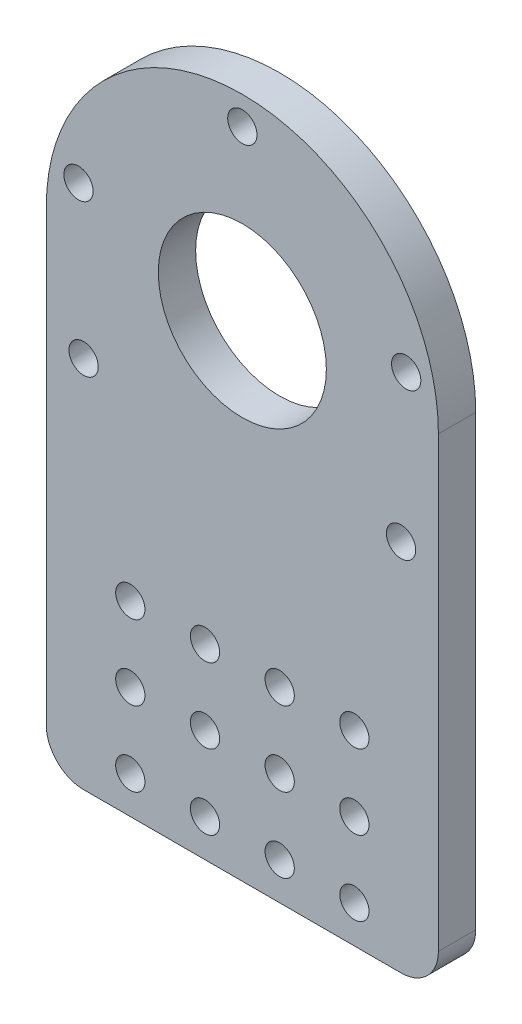
ISO-10303-21;
HEADER;
FILE_DESCRIPTION(('STEP AP214'),'2;1');
FILE_NAME('part.step','',(''),(''),'','','');
FILE_SCHEMA(('AUTOMOTIVE_DESIGN { 1 0 10303 214 1 1 1 1 }'));
ENDSEC;
DATA;
#1=APPLICATION_CONTEXT('core data for automotive mechanical design processes');
#2=APPLICATION_PROTOCOL_DEFINITION('international standard','automotive_design',2000,#1);
#3=PRODUCT_CONTEXT('',#1,'mechanical');
#4=PRODUCT('Part','Part','',(#3));
#5=PRODUCT_RELATED_PRODUCT_CATEGORY('part','',(#4));
#6=PRODUCT_DEFINITION_FORMATION('','',#4);
#7=PRODUCT_DEFINITION_CONTEXT('part definition',#1,'design');
#8=PRODUCT_DEFINITION('design','',#6,#7);
#9=PRODUCT_DEFINITION_SHAPE('','',#8);
#10=(LENGTH_UNIT() NAMED_UNIT(*) SI_UNIT(.MILLI.,.METRE.));
#11=(NAMED_UNIT(*) PLANE_ANGLE_UNIT() SI_UNIT($,.RADIAN.));
#12=(NAMED_UNIT(*) SI_UNIT($,.STERADIAN.) SOLID_ANGLE_UNIT());
#13=UNCERTAINTY_MEASURE_WITH_UNIT(LENGTH_MEASURE(1.E-05),#10,'distance_accuracy_value','');
#14=(GEOMETRIC_REPRESENTATION_CONTEXT(3) GLOBAL_UNCERTAINTY_ASSIGNED_CONTEXT((#13)) GLOBAL_UNIT_ASSIGNED_CONTEXT((#10,
#11,#12)) REPRESENTATION_CONTEXT('',''));
#15=CARTESIAN_POINT('',(0.,0.,0.));
#16=DIRECTION('',(0.,0.,1.));
#17=DIRECTION('',(1.,0.,0.));
#18=AXIS2_PLACEMENT_3D('',#15,#16,#17);
#19=CARTESIAN_POINT('',(0.,0.,3.175));
#20=DIRECTION('',(0.,0.,1.));
#21=DIRECTION('',(1.,0.,0.));
#22=AXIS2_PLACEMENT_3D('',#19,#20,#21);
#23=PLANE('',#22);
#24=CARTESIAN_POINT('',(27.86051192997,6.35,3.175));
#25=DIRECTION('',(0.,0.,1.));
#26=DIRECTION('',(1.,0.,0.));
#27=AXIS2_PLACEMENT_3D('',#24,#25,#26);
#28=CIRCLE('',#27,2.4892);
#29=CARTESIAN_POINT('',(30.34971192997,6.35,3.175));
#30=VERTEX_POINT('',#29);
#31=EDGE_CURVE('E485',#30,#30,#28,.T.);
#32=ORIENTED_EDGE('',*,*,#31,.F.);
#33=EDGE_LOOP('',(#32));
#34=FACE_BOUND('',#33,.T.);
#35=CARTESIAN_POINT('',(-27.86051192997,6.35,3.175));
#36=DIRECTION('',(0.,0.,1.));
#37=DIRECTION('',(1.,0.,0.));
#38=AXIS2_PLACEMENT_3D('',#35,#36,#37);
#39=CIRCLE('',#38,2.4892);
#40=CARTESIAN_POINT('',(-25.37131192997,6.35,3.175));
#41=VERTEX_POINT('',#40);
#42=EDGE_CURVE('E501',#41,#41,#39,.T.);
#43=ORIENTED_EDGE('',*,*,#42,.F.);
#44=EDGE_LOOP('',(#43));
#45=FACE_BOUND('',#44,.T.);
#46=CARTESIAN_POINT('',(0.,28.575,3.175));
#47=DIRECTION('',(0.,0.,1.));
#48=DIRECTION('',(1.,0.,0.));
#49=AXIS2_PLACEMENT_3D('',#46,#47,#48);
#50=CIRCLE('',#49,2.4892);
#51=CARTESIAN_POINT('',(2.4892,28.575,3.175));
#52=VERTEX_POINT('',#51);
#53=EDGE_CURVE('E517',#52,#52,#50,.T.);
#54=ORIENTED_EDGE('',*,*,#53,.F.);
#55=EDGE_LOOP('',(#54));
#56=FACE_BOUND('',#55,.T.);
#57=CARTESIAN_POINT('',(26.9875,-19.05,3.175));
#58=DIRECTION('',(0.,0.,1.));
#59=DIRECTION('',(1.,0.,0.));
#60=AXIS2_PLACEMENT_3D('',#57,#58,#59);
#61=CIRCLE('',#60,2.4892);
#62=CARTESIAN_POINT('',(29.4767,-19.05,3.175));
#63=VERTEX_POINT('',#62);
#64=EDGE_CURVE('E533',#63,#63,#61,.T.);
#65=ORIENTED_EDGE('',*,*,#64,.F.);
#66=EDGE_LOOP('',(#65));
#67=FACE_BOUND('',#66,.T.);
#68=CARTESIAN_POINT('',(-6.35,-50.8,3.175));
#69=DIRECTION('',(0.,0.,1.));
#70=DIRECTION('',(1.,0.,0.));
#71=AXIS2_PLACEMENT_3D('',#68,#69,#70);
#72=CIRCLE('',#71,2.48919999999999);
#73=CARTESIAN_POINT('',(-3.8608,-50.8,3.175));
#74=VERTEX_POINT('',#73);
#75=EDGE_CURVE('E549',#74,#74,#72,.T.);
#76=ORIENTED_EDGE('',*,*,#75,.F.);
#77=EDGE_LOOP('',(#76));
#78=FACE_BOUND('',#77,.T.);
#79=CARTESIAN_POINT('',(6.35,-63.5,3.175));
#80=DIRECTION('',(0.,0.,1.));
#81=DIRECTION('',(1.,0.,0.));
#82=AXIS2_PLACEMENT_3D('',#79,#80,#81);
#83=CIRCLE('',#82,2.48919999999999);
#84=CARTESIAN_POINT('',(8.83919999999999,-63.5,3.175));
#85=VERTEX_POINT('',#84);
#86=EDGE_CURVE('E565',#85,#85,#83,.T.);
#87=ORIENTED_EDGE('',*,*,#86,.F.);
#88=EDGE_LOOP('',(#87));
#89=FACE_BOUND('',#88,.T.);
#90=CARTESIAN_POINT('',(-6.35,-63.5,3.175));
#91=DIRECTION('',(0.,0.,1.));
#92=DIRECTION('',(1.,0.,0.));
#93=AXIS2_PLACEMENT_3D('',#90,#91,#92);
#94=CIRCLE('',#93,2.48919999999999);
#95=CARTESIAN_POINT('',(-3.8608,-63.5,3.175));
#96=VERTEX_POINT('',#95);
#97=EDGE_CURVE('E581',#96,#96,#94,.T.);
#98=ORIENTED_EDGE('',*,*,#97,.F.);
#99=EDGE_LOOP('',(#98));
#100=FACE_BOUND('',#99,.T.);
#101=CARTESIAN_POINT('',(6.35,-76.2,3.175));
#102=DIRECTION('',(0.,0.,1.));
#103=DIRECTION('',(1.,0.,0.));
#104=AXIS2_PLACEMENT_3D('',#101,#102,#103);
#105=CIRCLE('',#104,2.48919999999999);
#106=CARTESIAN_POINT('',(8.83919999999999,-76.2,3.175));
#107=VERTEX_POINT('',#106);
#108=EDGE_CURVE('E597',#107,#107,#105,.T.);
#109=ORIENTED_EDGE('',*,*,#108,.F.);
#110=EDGE_LOOP('',(#109));
#111=FACE_BOUND('',#110,.T.);
#112=CARTESIAN_POINT('',(0.,0.,3.175));
#113=DIRECTION('',(0.,0.,1.));
#114=DIRECTION('',(1.,0.,0.));
#115=AXIS2_PLACEMENT_3D('',#112,#113,#114);
#116=CIRCLE('',#115,14.2875);
#117=CARTESIAN_POINT('',(14.2875,0.,3.175));
#118=VERTEX_POINT('',#117);
#119=EDGE_CURVE('E165',#118,#118,#116,.T.);
#120=ORIENTED_EDGE('',*,*,#119,.F.);
#121=EDGE_LOOP('',(#120));
#122=FACE_BOUND('',#121,.T.);
#123=DIRECTION('',(0.,-1.,0.));
#124=VECTOR('',#123,1.);
#125=CARTESIAN_POINT('',(-33.3375,0.,3.175));
#126=LINE('',#125,#124);
#127=CARTESIAN_POINT('',(-33.3375,0.,3.175));
#128=VERTEX_POINT('',#127);
#129=CARTESIAN_POINT('',(-33.3375,-76.2,3.175));
#130=VERTEX_POINT('',#129);
#131=EDGE_CURVE('E97',#128,#130,#126,.T.);
#132=ORIENTED_EDGE('',*,*,#131,.T.);
#133=CARTESIAN_POINT('',(-26.9875,-76.2,3.175));
#134=DIRECTION('',(0.,0.,1.));
#135=DIRECTION('',(1.,0.,0.));
#136=AXIS2_PLACEMENT_3D('',#133,#134,#135);
#137=CIRCLE('',#136,6.35);
#138=CARTESIAN_POINT('',(-26.9875,-82.55,3.175));
#139=VERTEX_POINT('',#138);
#140=EDGE_CURVE('E52',#130,#139,#137,.T.);
#141=ORIENTED_EDGE('',*,*,#140,.T.);
#142=DIRECTION('',(1.,0.,0.));
#143=VECTOR('',#142,1.);
#144=CARTESIAN_POINT('',(-33.3375,-82.55,3.175));
#145=LINE('',#144,#143);
#146=CARTESIAN_POINT('',(26.9875,-82.55,3.175));
#147=VERTEX_POINT('',#146);
#148=EDGE_CURVE('E105',#139,#147,#145,.T.);
#149=ORIENTED_EDGE('',*,*,#148,.T.);
#150=CARTESIAN_POINT('',(26.9875,-76.2,3.175));
#151=DIRECTION('',(0.,0.,1.));
#152=DIRECTION('',(1.,0.,0.));
#153=AXIS2_PLACEMENT_3D('',#150,#151,#152);
#154=CIRCLE('',#153,6.35);
#155=CARTESIAN_POINT('',(33.3375,-76.2,3.175));
#156=VERTEX_POINT('',#155);
#157=EDGE_CURVE('E59',#147,#156,#154,.T.);
#158=ORIENTED_EDGE('',*,*,#157,.T.);
#159=DIRECTION('',(0.,1.,0.));
#160=VECTOR('',#159,1.);
#161=CARTESIAN_POINT('',(33.3375,0.,3.175));
#162=LINE('',#161,#160);
#163=CARTESIAN_POINT('',(33.3375,0.,3.175));
#164=VERTEX_POINT('',#163);
#165=EDGE_CURVE('E110',#156,#164,#162,.T.);
#166=ORIENTED_EDGE('',*,*,#165,.T.);
#167=CARTESIAN_POINT('',(0.,0.,3.175));
#168=DIRECTION('',(0.,0.,1.));
#169=DIRECTION('',(1.,0.,0.));
#170=AXIS2_PLACEMENT_3D('',#167,#168,#169);
#171=CIRCLE('',#170,33.3375);
#172=EDGE_CURVE('E106',#164,#128,#171,.T.);
#173=ORIENTED_EDGE('',*,*,#172,.T.);
#174=EDGE_LOOP('',(#132,#141,#149,#158,#166,#173));
#175=FACE_BOUND('',#174,.T.);
#176=CARTESIAN_POINT('',(-19.05,-76.2,3.175));
#177=DIRECTION('',(0.,0.,1.));
#178=DIRECTION('',(1.,0.,0.));
#179=AXIS2_PLACEMENT_3D('',#176,#177,#178);
#180=CIRCLE('',#179,2.48919999999999);
#181=CARTESIAN_POINT('',(-16.5608,-76.2,3.175));
#182=VERTEX_POINT('',#181);
#183=EDGE_CURVE('E605',#182,#182,#180,.T.);
#184=ORIENTED_EDGE('',*,*,#183,.F.);
#185=EDGE_LOOP('',(#184));
#186=FACE_BOUND('',#185,.T.);
#187=CARTESIAN_POINT('',(-6.35,-76.2,3.175));
#188=DIRECTION('',(0.,0.,1.));
#189=DIRECTION('',(1.,0.,0.));
#190=AXIS2_PLACEMENT_3D('',#187,#188,#189);
#191=CIRCLE('',#190,2.48919999999999);
#192=CARTESIAN_POINT('',(-3.8608,-76.2,3.175));
#193=VERTEX_POINT('',#192);
#194=EDGE_CURVE('E589',#193,#193,#191,.T.);
#195=ORIENTED_EDGE('',*,*,#194,.F.);
#196=EDGE_LOOP('',(#195));
#197=FACE_BOUND('',#196,.T.);
#198=CARTESIAN_POINT('',(-19.05,-63.5,3.175));
#199=DIRECTION('',(0.,0.,1.));
#200=DIRECTION('',(1.,0.,0.));
#201=AXIS2_PLACEMENT_3D('',#198,#199,#200);
#202=CIRCLE('',#201,2.48919999999999);
#203=CARTESIAN_POINT('',(-16.5608,-63.5,3.175));
#204=VERTEX_POINT('',#203);
#205=EDGE_CURVE('E573',#204,#204,#202,.T.);
#206=ORIENTED_EDGE('',*,*,#205,.F.);
#207=EDGE_LOOP('',(#206));
#208=FACE_BOUND('',#207,.T.);
#209=CARTESIAN_POINT('',(-19.05,-50.8,3.175));
#210=DIRECTION('',(0.,0.,1.));
#211=DIRECTION('',(1.,0.,0.));
#212=AXIS2_PLACEMENT_3D('',#209,#210,#211);
#213=CIRCLE('',#212,2.48919999999999);
#214=CARTESIAN_POINT('',(-16.5608,-50.8,3.175));
#215=VERTEX_POINT('',#214);
#216=EDGE_CURVE('E557',#215,#215,#213,.T.);
#217=ORIENTED_EDGE('',*,*,#216,.F.);
#218=EDGE_LOOP('',(#217));
#219=FACE_BOUND('',#218,.T.);
#220=CARTESIAN_POINT('',(6.35,-50.8,3.175));
#221=DIRECTION('',(0.,0.,1.));
#222=DIRECTION('',(1.,0.,0.));
#223=AXIS2_PLACEMENT_3D('',#220,#221,#222);
#224=CIRCLE('',#223,2.48919999999999);
#225=CARTESIAN_POINT('',(8.83919999999999,-50.8,3.175));
#226=VERTEX_POINT('',#225);
#227=EDGE_CURVE('E541',#226,#226,#224,.T.);
#228=ORIENTED_EDGE('',*,*,#227,.F.);
#229=EDGE_LOOP('',(#228));
#230=FACE_BOUND('',#229,.T.);
#231=CARTESIAN_POINT('',(19.05,-76.2,3.175));
#232=DIRECTION('',(0.,0.,1.));
#233=DIRECTION('',(1.,0.,0.));
#234=AXIS2_PLACEMENT_3D('',#231,#232,#233);
#235=CIRCLE('',#234,2.48919999999999);
#236=CARTESIAN_POINT('',(21.5392,-76.2,3.175));
#237=VERTEX_POINT('',#236);
#238=EDGE_CURVE('E525',#237,#237,#235,.T.);
#239=ORIENTED_EDGE('',*,*,#238,.F.);
#240=EDGE_LOOP('',(#239));
#241=FACE_BOUND('',#240,.T.);
#242=CARTESIAN_POINT('',(19.05,-63.5,3.175));
#243=DIRECTION('',(0.,0.,1.));
#244=DIRECTION('',(1.,0.,0.));
#245=AXIS2_PLACEMENT_3D('',#242,#243,#244);
#246=CIRCLE('',#245,2.48919999999999);
#247=CARTESIAN_POINT('',(21.5392,-63.5,3.175));
#248=VERTEX_POINT('',#247);
#249=EDGE_CURVE('E509',#248,#248,#246,.T.);
#250=ORIENTED_EDGE('',*,*,#249,.F.);
#251=EDGE_LOOP('',(#250));
#252=FACE_BOUND('',#251,.T.);
#253=CARTESIAN_POINT('',(19.05,-50.8,3.175));
#254=DIRECTION('',(0.,0.,1.));
#255=DIRECTION('',(1.,0.,0.));
#256=AXIS2_PLACEMENT_3D('',#253,#254,#255);
#257=CIRCLE('',#256,2.48919999999999);
#258=CARTESIAN_POINT('',(21.5392,-50.8,3.175));
#259=VERTEX_POINT('',#258);
#260=EDGE_CURVE('E493',#259,#259,#257,.T.);
#261=ORIENTED_EDGE('',*,*,#260,.F.);
#262=EDGE_LOOP('',(#261));
#263=FACE_BOUND('',#262,.T.);
#264=CARTESIAN_POINT('',(-26.9875,-19.05,3.175));
#265=DIRECTION('',(0.,0.,1.));
#266=DIRECTION('',(-1.,0.,0.));
#267=AXIS2_PLACEMENT_3D('',#264,#265,#266);
#268=CIRCLE('',#267,2.4892);
#269=CARTESIAN_POINT('',(-29.4767,-19.05,3.175));
#270=VERTEX_POINT('',#269);
#271=EDGE_CURVE('E474',#270,#270,#268,.T.);
#272=ORIENTED_EDGE('',*,*,#271,.F.);
#273=EDGE_LOOP('',(#272));
#274=FACE_BOUND('',#273,.T.);
#275=ADVANCED_FACE('F43',(#34,#45,#56,#67,#78,#89,#100,#111,#122,#175,#186,#197,#208,#219,#230,
#241,#252,#263,#274),#23,.T.);
#276=CARTESIAN_POINT('',(0.,0.,-3.175));
#277=DIRECTION('',(0.,0.,1.));
#278=DIRECTION('',(1.,0.,0.));
#279=AXIS2_PLACEMENT_3D('',#276,#277,#278);
#280=PLANE('',#279);
#281=DIRECTION('',(1.,0.,0.));
#282=VECTOR('',#281,1.);
#283=CARTESIAN_POINT('',(-33.3375,-82.55,-3.175));
#284=LINE('',#283,#282);
#285=CARTESIAN_POINT('',(-26.9875,-82.55,-3.175));
#286=VERTEX_POINT('',#285);
#287=CARTESIAN_POINT('',(26.9875,-82.55,-3.175));
#288=VERTEX_POINT('',#287);
#289=EDGE_CURVE('E159',#286,#288,#284,.T.);
#290=ORIENTED_EDGE('',*,*,#289,.F.);
#291=CARTESIAN_POINT('',(-26.9875,-76.2,-3.175));
#292=DIRECTION('',(0.,0.,1.));
#293=DIRECTION('',(1.,0.,0.));
#294=AXIS2_PLACEMENT_3D('',#291,#292,#293);
#295=CIRCLE('',#294,6.35);
#296=CARTESIAN_POINT('',(-33.3375,-76.2,-3.175));
#297=VERTEX_POINT('',#296);
#298=EDGE_CURVE('E137',#286,#297,#295,.F.);
#299=ORIENTED_EDGE('',*,*,#298,.T.);
#300=DIRECTION('',(0.,-1.,0.));
#301=VECTOR('',#300,1.);
#302=CARTESIAN_POINT('',(-33.3375,0.,-3.175));
#303=LINE('',#302,#301);
#304=CARTESIAN_POINT('',(-33.3375,0.,-3.175));
#305=VERTEX_POINT('',#304);
#306=EDGE_CURVE('E158',#305,#297,#303,.T.);
#307=ORIENTED_EDGE('',*,*,#306,.F.);
#308=CARTESIAN_POINT('',(0.,0.,-3.175));
#309=DIRECTION('',(0.,0.,1.));
#310=DIRECTION('',(1.,0.,0.));
#311=AXIS2_PLACEMENT_3D('',#308,#309,#310);
#312=CIRCLE('',#311,33.3375);
#313=CARTESIAN_POINT('',(33.3375,0.,-3.175));
#314=VERTEX_POINT('',#313);
#315=EDGE_CURVE('E119',#314,#305,#312,.T.);
#316=ORIENTED_EDGE('',*,*,#315,.F.);
#317=DIRECTION('',(0.,1.,0.));
#318=VECTOR('',#317,1.);
#319=CARTESIAN_POINT('',(33.3375,0.,-3.175));
#320=LINE('',#319,#318);
#321=CARTESIAN_POINT('',(33.3375,-76.2,-3.175));
#322=VERTEX_POINT('',#321);
#323=EDGE_CURVE('E115',#322,#314,#320,.T.);
#324=ORIENTED_EDGE('',*,*,#323,.F.);
#325=CARTESIAN_POINT('',(26.9875,-76.2,-3.175));
#326=DIRECTION('',(0.,0.,1.));
#327=DIRECTION('',(1.,0.,0.));
#328=AXIS2_PLACEMENT_3D('',#325,#326,#327);
#329=CIRCLE('',#328,6.35);
#330=EDGE_CURVE('E134',#322,#288,#329,.F.);
#331=ORIENTED_EDGE('',*,*,#330,.T.);
#332=EDGE_LOOP('',(#290,#299,#307,#316,#324,#331));
#333=FACE_BOUND('',#332,.T.);
#334=CARTESIAN_POINT('',(0.,0.,-3.175));
#335=DIRECTION('',(0.,0.,1.));
#336=DIRECTION('',(1.,0.,0.));
#337=AXIS2_PLACEMENT_3D('',#334,#335,#336);
#338=CIRCLE('',#337,14.2875);
#339=CARTESIAN_POINT('',(14.2875,0.,-3.175));
#340=VERTEX_POINT('',#339);
#341=EDGE_CURVE('E609',#340,#340,#338,.T.);
#342=ORIENTED_EDGE('',*,*,#341,.T.);
#343=EDGE_LOOP('',(#342));
#344=FACE_BOUND('',#343,.T.);
#345=CARTESIAN_POINT('',(-19.05,-76.2,-3.175));
#346=DIRECTION('',(0.,0.,1.));
#347=DIRECTION('',(1.,0.,0.));
#348=AXIS2_PLACEMENT_3D('',#345,#346,#347);
#349=CIRCLE('',#348,2.48919999999999);
#350=CARTESIAN_POINT('',(-16.5608,-76.2,-3.175));
#351=VERTEX_POINT('',#350);
#352=EDGE_CURVE('E601',#351,#351,#349,.T.);
#353=ORIENTED_EDGE('',*,*,#352,.T.);
#354=EDGE_LOOP('',(#353));
#355=FACE_BOUND('',#354,.T.);
#356=CARTESIAN_POINT('',(6.35,-76.2,-3.175));
#357=DIRECTION('',(0.,0.,1.));
#358=DIRECTION('',(1.,0.,0.));
#359=AXIS2_PLACEMENT_3D('',#356,#357,#358);
#360=CIRCLE('',#359,2.48919999999999);
#361=CARTESIAN_POINT('',(8.83919999999999,-76.2,-3.175));
#362=VERTEX_POINT('',#361);
#363=EDGE_CURVE('E593',#362,#362,#360,.T.);
#364=ORIENTED_EDGE('',*,*,#363,.T.);
#365=EDGE_LOOP('',(#364));
#366=FACE_BOUND('',#365,.T.);
#367=CARTESIAN_POINT('',(-6.35,-76.2,-3.175));
#368=DIRECTION('',(0.,0.,1.));
#369=DIRECTION('',(1.,0.,0.));
#370=AXIS2_PLACEMENT_3D('',#367,#368,#369);
#371=CIRCLE('',#370,2.48919999999999);
#372=CARTESIAN_POINT('',(-3.8608,-76.2,-3.175));
#373=VERTEX_POINT('',#372);
#374=EDGE_CURVE('E585',#373,#373,#371,.T.);
#375=ORIENTED_EDGE('',*,*,#374,.T.);
#376=EDGE_LOOP('',(#375));
#377=FACE_BOUND('',#376,.T.);
#378=CARTESIAN_POINT('',(-6.35,-63.5,-3.175));
#379=DIRECTION('',(0.,0.,1.));
#380=DIRECTION('',(1.,0.,0.));
#381=AXIS2_PLACEMENT_3D('',#378,#379,#380);
#382=CIRCLE('',#381,2.48919999999999);
#383=CARTESIAN_POINT('',(-3.8608,-63.5,-3.175));
#384=VERTEX_POINT('',#383);
#385=EDGE_CURVE('E577',#384,#384,#382,.T.);
#386=ORIENTED_EDGE('',*,*,#385,.T.);
#387=EDGE_LOOP('',(#386));
#388=FACE_BOUND('',#387,.T.);
#389=CARTESIAN_POINT('',(-19.05,-63.5,-3.175));
#390=DIRECTION('',(0.,0.,1.));
#391=DIRECTION('',(1.,0.,0.));
#392=AXIS2_PLACEMENT_3D('',#389,#390,#391);
#393=CIRCLE('',#392,2.48919999999999);
#394=CARTESIAN_POINT('',(-16.5608,-63.5,-3.175));
#395=VERTEX_POINT('',#394);
#396=EDGE_CURVE('E569',#395,#395,#393,.T.);
#397=ORIENTED_EDGE('',*,*,#396,.T.);
#398=EDGE_LOOP('',(#397));
#399=FACE_BOUND('',#398,.T.);
#400=CARTESIAN_POINT('',(6.35,-63.5,-3.175));
#401=DIRECTION('',(0.,0.,1.));
#402=DIRECTION('',(1.,0.,0.));
#403=AXIS2_PLACEMENT_3D('',#400,#401,#402);
#404=CIRCLE('',#403,2.48919999999999);
#405=CARTESIAN_POINT('',(8.83919999999999,-63.5,-3.175));
#406=VERTEX_POINT('',#405);
#407=EDGE_CURVE('E561',#406,#406,#404,.T.);
#408=ORIENTED_EDGE('',*,*,#407,.T.);
#409=EDGE_LOOP('',(#408));
#410=FACE_BOUND('',#409,.T.);
#411=CARTESIAN_POINT('',(-19.05,-50.8,-3.175));
#412=DIRECTION('',(0.,0.,1.));
#413=DIRECTION('',(1.,0.,0.));
#414=AXIS2_PLACEMENT_3D('',#411,#412,#413);
#415=CIRCLE('',#414,2.48919999999999);
#416=CARTESIAN_POINT('',(-16.5608,-50.8,-3.175));
#417=VERTEX_POINT('',#416);
#418=EDGE_CURVE('E553',#417,#417,#415,.T.);
#419=ORIENTED_EDGE('',*,*,#418,.T.);
#420=EDGE_LOOP('',(#419));
#421=FACE_BOUND('',#420,.T.);
#422=CARTESIAN_POINT('',(-6.35,-50.8,-3.175));
#423=DIRECTION('',(0.,0.,1.));
#424=DIRECTION('',(1.,0.,0.));
#425=AXIS2_PLACEMENT_3D('',#422,#423,#424);
#426=CIRCLE('',#425,2.48919999999999);
#427=CARTESIAN_POINT('',(-3.8608,-50.8,-3.175));
#428=VERTEX_POINT('',#427);
#429=EDGE_CURVE('E545',#428,#428,#426,.T.);
#430=ORIENTED_EDGE('',*,*,#429,.T.);
#431=EDGE_LOOP('',(#430));
#432=FACE_BOUND('',#431,.T.);
#433=CARTESIAN_POINT('',(6.35,-50.8,-3.175));
#434=DIRECTION('',(0.,0.,1.));
#435=DIRECTION('',(1.,0.,0.));
#436=AXIS2_PLACEMENT_3D('',#433,#434,#435);
#437=CIRCLE('',#436,2.48919999999999);
#438=CARTESIAN_POINT('',(8.83919999999999,-50.8,-3.175));
#439=VERTEX_POINT('',#438);
#440=EDGE_CURVE('E537',#439,#439,#437,.T.);
#441=ORIENTED_EDGE('',*,*,#440,.T.);
#442=EDGE_LOOP('',(#441));
#443=FACE_BOUND('',#442,.T.);
#444=CARTESIAN_POINT('',(26.9875,-19.05,-3.175));
#445=DIRECTION('',(0.,0.,1.));
#446=DIRECTION('',(1.,0.,0.));
#447=AXIS2_PLACEMENT_3D('',#444,#445,#446);
#448=CIRCLE('',#447,2.4892);
#449=CARTESIAN_POINT('',(29.4767,-19.05,-3.175));
#450=VERTEX_POINT('',#449);
#451=EDGE_CURVE('E529',#450,#450,#448,.T.);
#452=ORIENTED_EDGE('',*,*,#451,.T.);
#453=EDGE_LOOP('',(#452));
#454=FACE_BOUND('',#453,.T.);
#455=CARTESIAN_POINT('',(19.05,-76.2,-3.175));
#456=DIRECTION('',(0.,0.,1.));
#457=DIRECTION('',(1.,0.,0.));
#458=AXIS2_PLACEMENT_3D('',#455,#456,#457);
#459=CIRCLE('',#458,2.48919999999999);
#460=CARTESIAN_POINT('',(21.5392,-76.2,-3.175));
#461=VERTEX_POINT('',#460);
#462=EDGE_CURVE('E521',#461,#461,#459,.T.);
#463=ORIENTED_EDGE('',*,*,#462,.T.);
#464=EDGE_LOOP('',(#463));
#465=FACE_BOUND('',#464,.T.);
#466=CARTESIAN_POINT('',(0.,28.575,-3.175));
#467=DIRECTION('',(0.,0.,1.));
#468=DIRECTION('',(1.,0.,0.));
#469=AXIS2_PLACEMENT_3D('',#466,#467,#468);
#470=CIRCLE('',#469,2.4892);
#471=CARTESIAN_POINT('',(2.4892,28.575,-3.175));
#472=VERTEX_POINT('',#471);
#473=EDGE_CURVE('E513',#472,#472,#470,.T.);
#474=ORIENTED_EDGE('',*,*,#473,.T.);
#475=EDGE_LOOP('',(#474));
#476=FACE_BOUND('',#475,.T.);
#477=CARTESIAN_POINT('',(19.05,-63.5,-3.175));
#478=DIRECTION('',(0.,0.,1.));
#479=DIRECTION('',(1.,0.,0.));
#480=AXIS2_PLACEMENT_3D('',#477,#478,#479);
#481=CIRCLE('',#480,2.48919999999999);
#482=CARTESIAN_POINT('',(21.5392,-63.5,-3.175));
#483=VERTEX_POINT('',#482);
#484=EDGE_CURVE('E505',#483,#483,#481,.T.);
#485=ORIENTED_EDGE('',*,*,#484,.T.);
#486=EDGE_LOOP('',(#485));
#487=FACE_BOUND('',#486,.T.);
#488=CARTESIAN_POINT('',(-27.86051192997,6.35,-3.175));
#489=DIRECTION('',(0.,0.,1.));
#490=DIRECTION('',(1.,0.,0.));
#491=AXIS2_PLACEMENT_3D('',#488,#489,#490);
#492=CIRCLE('',#491,2.4892);
#493=CARTESIAN_POINT('',(-25.37131192997,6.35,-3.175));
#494=VERTEX_POINT('',#493);
#495=EDGE_CURVE('E497',#494,#494,#492,.T.);
#496=ORIENTED_EDGE('',*,*,#495,.T.);
#497=EDGE_LOOP('',(#496));
#498=FACE_BOUND('',#497,.T.);
#499=CARTESIAN_POINT('',(19.05,-50.8,-3.175));
#500=DIRECTION('',(0.,0.,1.));
#501=DIRECTION('',(1.,0.,0.));
#502=AXIS2_PLACEMENT_3D('',#499,#500,#501);
#503=CIRCLE('',#502,2.48919999999999);
#504=CARTESIAN_POINT('',(21.5392,-50.8,-3.175));
#505=VERTEX_POINT('',#504);
#506=EDGE_CURVE('E489',#505,#505,#503,.T.);
#507=ORIENTED_EDGE('',*,*,#506,.T.);
#508=EDGE_LOOP('',(#507));
#509=FACE_BOUND('',#508,.T.);
#510=CARTESIAN_POINT('',(27.86051192997,6.35,-3.175));
#511=DIRECTION('',(0.,0.,1.));
#512=DIRECTION('',(1.,0.,0.));
#513=AXIS2_PLACEMENT_3D('',#510,#511,#512);
#514=CIRCLE('',#513,2.4892);
#515=CARTESIAN_POINT('',(30.34971192997,6.35,-3.175));
#516=VERTEX_POINT('',#515);
#517=EDGE_CURVE('E482',#516,#516,#514,.T.);
#518=ORIENTED_EDGE('',*,*,#517,.T.);
#519=EDGE_LOOP('',(#518));
#520=FACE_BOUND('',#519,.T.);
#521=CARTESIAN_POINT('',(-26.9875,-19.05,-3.175));
#522=DIRECTION('',(0.,0.,1.));
#523=DIRECTION('',(-1.,0.,0.));
#524=AXIS2_PLACEMENT_3D('',#521,#522,#523);
#525=CIRCLE('',#524,2.4892);
#526=CARTESIAN_POINT('',(-29.4767,-19.05,-3.175));
#527=VERTEX_POINT('',#526);
#528=EDGE_CURVE('E477',#527,#527,#525,.T.);
#529=ORIENTED_EDGE('',*,*,#528,.T.);
#530=EDGE_LOOP('',(#529));
#531=FACE_BOUND('',#530,.T.);
#532=ADVANCED_FACE('F156',(#333,#344,#355,#366,#377,#388,#399,#410,#421,#432,#443,#454,#465,
#476,#487,#498,#509,#520,#531),#280,.F.);
#533=CARTESIAN_POINT('',(0.,0.,3.175));
#534=DIRECTION('',(0.,0.,-1.));
#535=DIRECTION('',(-1.,0.,0.));
#536=AXIS2_PLACEMENT_3D('',#533,#534,#535);
#537=CYLINDRICAL_SURFACE('',#536,33.3375);
#538=ORIENTED_EDGE('',*,*,#315,.T.);
#539=DIRECTION('',(0.,0.,-1.));
#540=VECTOR('',#539,1.);
#541=CARTESIAN_POINT('',(-33.3375,0.,3.175));
#542=LINE('',#541,#540);
#543=EDGE_CURVE('E101',#128,#305,#542,.T.);
#544=ORIENTED_EDGE('',*,*,#543,.F.);
#545=ORIENTED_EDGE('',*,*,#172,.F.);
#546=DIRECTION('',(0.,0.,-1.));
#547=VECTOR('',#546,1.);
#548=CARTESIAN_POINT('',(33.3375,0.,3.175));
#549=LINE('',#548,#547);
#550=EDGE_CURVE('E122',#164,#314,#549,.T.);
#551=ORIENTED_EDGE('',*,*,#550,.T.);
#552=EDGE_LOOP('',(#538,#544,#545,#551));
#553=FACE_BOUND('',#552,.T.);
#554=ADVANCED_FACE('F117',(#553),#537,.T.);
#555=CARTESIAN_POINT('',(-33.3375,0.,3.175));
#556=DIRECTION('',(1.,0.,0.));
#557=DIRECTION('',(0.,0.,-1.));
#558=AXIS2_PLACEMENT_3D('',#555,#556,#557);
#559=PLANE('',#558);
#560=ORIENTED_EDGE('',*,*,#306,.T.);
#561=DIRECTION('',(0.,0.,-1.));
#562=VECTOR('',#561,1.);
#563=CARTESIAN_POINT('',(-33.3375,-76.2,3.175));
#564=LINE('',#563,#562);
#565=EDGE_CURVE('E67',#297,#130,#564,.F.);
#566=ORIENTED_EDGE('',*,*,#565,.T.);
#567=ORIENTED_EDGE('',*,*,#131,.F.);
#568=ORIENTED_EDGE('',*,*,#543,.T.);
#569=EDGE_LOOP('',(#560,#566,#567,#568));
#570=FACE_BOUND('',#569,.T.);
#571=ADVANCED_FACE('F99',(#570),#559,.F.);
#572=CARTESIAN_POINT('',(-33.3375,-82.55,3.175));
#573=DIRECTION('',(0.,1.,0.));
#574=DIRECTION('',(0.,0.,1.));
#575=AXIS2_PLACEMENT_3D('',#572,#573,#574);
#576=PLANE('',#575);
#577=ORIENTED_EDGE('',*,*,#148,.F.);
#578=DIRECTION('',(0.,0.,-1.));
#579=VECTOR('',#578,1.);
#580=CARTESIAN_POINT('',(-26.9875,-82.55,3.175));
#581=LINE('',#580,#579);
#582=EDGE_CURVE('E126',#139,#286,#581,.T.);
#583=ORIENTED_EDGE('',*,*,#582,.T.);
#584=ORIENTED_EDGE('',*,*,#289,.T.);
#585=DIRECTION('',(0.,0.,-1.));
#586=VECTOR('',#585,1.);
#587=CARTESIAN_POINT('',(26.9875,-82.55,3.175));
#588=LINE('',#587,#586);
#589=EDGE_CURVE('E121',#288,#147,#588,.F.);
#590=ORIENTED_EDGE('',*,*,#589,.T.);
#591=EDGE_LOOP('',(#577,#583,#584,#590));
#592=FACE_BOUND('',#591,.T.);
#593=ADVANCED_FACE('F148',(#592),#576,.F.);
#594=CARTESIAN_POINT('',(33.3375,0.,3.175));
#595=DIRECTION('',(-1.,0.,0.));
#596=DIRECTION('',(0.,-1.,0.));
#597=AXIS2_PLACEMENT_3D('',#594,#595,#596);
#598=PLANE('',#597);
#599=ORIENTED_EDGE('',*,*,#165,.F.);
#600=DIRECTION('',(0.,0.,-1.));
#601=VECTOR('',#600,1.);
#602=CARTESIAN_POINT('',(33.3375,-76.2,3.175));
#603=LINE('',#602,#601);
#604=EDGE_CURVE('E11',#156,#322,#603,.T.);
#605=ORIENTED_EDGE('',*,*,#604,.T.);
#606=ORIENTED_EDGE('',*,*,#323,.T.);
#607=ORIENTED_EDGE('',*,*,#550,.F.);
#608=EDGE_LOOP('',(#599,#605,#606,#607));
#609=FACE_BOUND('',#608,.T.);
#610=ADVANCED_FACE('F171',(#609),#598,.F.);
#611=CARTESIAN_POINT('',(0.,0.,3.175));
#612=DIRECTION('',(0.,0.,-1.));
#613=DIRECTION('',(-1.,0.,0.));
#614=AXIS2_PLACEMENT_3D('',#611,#612,#613);
#615=CYLINDRICAL_SURFACE('',#614,14.2875);
#616=ORIENTED_EDGE('',*,*,#119,.T.);
#617=EDGE_LOOP('',(#616));
#618=FACE_BOUND('',#617,.T.);
#619=ORIENTED_EDGE('',*,*,#341,.F.);
#620=EDGE_LOOP('',(#619));
#621=FACE_BOUND('',#620,.T.);
#622=ADVANCED_FACE('F189',(#618,#621),#615,.F.);
#623=CARTESIAN_POINT('',(-19.05,-76.2,3.175));
#624=DIRECTION('',(0.,0.,-1.));
#625=DIRECTION('',(-1.,0.,0.));
#626=AXIS2_PLACEMENT_3D('',#623,#624,#625);
#627=CYLINDRICAL_SURFACE('',#626,2.48919999999999);
#628=ORIENTED_EDGE('',*,*,#183,.T.);
#629=EDGE_LOOP('',(#628));
#630=FACE_BOUND('',#629,.T.);
#631=ORIENTED_EDGE('',*,*,#352,.F.);
#632=EDGE_LOOP('',(#631));
#633=FACE_BOUND('',#632,.T.);
#634=ADVANCED_FACE('F222',(#630,#633),#627,.F.);
#635=CARTESIAN_POINT('',(6.35,-76.2,3.175));
#636=DIRECTION('',(0.,0.,-1.));
#637=DIRECTION('',(-1.,0.,0.));
#638=AXIS2_PLACEMENT_3D('',#635,#636,#637);
#639=CYLINDRICAL_SURFACE('',#638,2.48919999999999);
#640=ORIENTED_EDGE('',*,*,#108,.T.);
#641=EDGE_LOOP('',(#640));
#642=FACE_BOUND('',#641,.T.);
#643=ORIENTED_EDGE('',*,*,#363,.F.);
#644=EDGE_LOOP('',(#643));
#645=FACE_BOUND('',#644,.T.);
#646=ADVANCED_FACE('F229',(#642,#645),#639,.F.);
#647=CARTESIAN_POINT('',(-6.35,-76.2,3.175));
#648=DIRECTION('',(0.,0.,-1.));
#649=DIRECTION('',(-1.,0.,0.));
#650=AXIS2_PLACEMENT_3D('',#647,#648,#649);
#651=CYLINDRICAL_SURFACE('',#650,2.48919999999999);
#652=ORIENTED_EDGE('',*,*,#194,.T.);
#653=EDGE_LOOP('',(#652));
#654=FACE_BOUND('',#653,.T.);
#655=ORIENTED_EDGE('',*,*,#374,.F.);
#656=EDGE_LOOP('',(#655));
#657=FACE_BOUND('',#656,.T.);
#658=ADVANCED_FACE('F236',(#654,#657),#651,.F.);
#659=CARTESIAN_POINT('',(-6.35,-63.5,3.175));
#660=DIRECTION('',(0.,0.,-1.));
#661=DIRECTION('',(-1.,0.,0.));
#662=AXIS2_PLACEMENT_3D('',#659,#660,#661);
#663=CYLINDRICAL_SURFACE('',#662,2.48919999999999);
#664=ORIENTED_EDGE('',*,*,#97,.T.);
#665=EDGE_LOOP('',(#664));
#666=FACE_BOUND('',#665,.T.);
#667=ORIENTED_EDGE('',*,*,#385,.F.);
#668=EDGE_LOOP('',(#667));
#669=FACE_BOUND('',#668,.T.);
#670=ADVANCED_FACE('F244',(#666,#669),#663,.F.);
#671=CARTESIAN_POINT('',(-19.05,-63.5,3.175));
#672=DIRECTION('',(0.,0.,-1.));
#673=DIRECTION('',(-1.,0.,0.));
#674=AXIS2_PLACEMENT_3D('',#671,#672,#673);
#675=CYLINDRICAL_SURFACE('',#674,2.48919999999999);
#676=ORIENTED_EDGE('',*,*,#205,.T.);
#677=EDGE_LOOP('',(#676));
#678=FACE_BOUND('',#677,.T.);
#679=ORIENTED_EDGE('',*,*,#396,.F.);
#680=EDGE_LOOP('',(#679));
#681=FACE_BOUND('',#680,.T.);
#682=ADVANCED_FACE('F252',(#678,#681),#675,.F.);
#683=CARTESIAN_POINT('',(6.35,-63.5,3.175));
#684=DIRECTION('',(0.,0.,-1.));
#685=DIRECTION('',(-1.,0.,0.));
#686=AXIS2_PLACEMENT_3D('',#683,#684,#685);
#687=CYLINDRICAL_SURFACE('',#686,2.48919999999999);
#688=ORIENTED_EDGE('',*,*,#86,.T.);
#689=EDGE_LOOP('',(#688));
#690=FACE_BOUND('',#689,.T.);
#691=ORIENTED_EDGE('',*,*,#407,.F.);
#692=EDGE_LOOP('',(#691));
#693=FACE_BOUND('',#692,.T.);
#694=ADVANCED_FACE('F260',(#690,#693),#687,.F.);
#695=CARTESIAN_POINT('',(-19.05,-50.8,3.175));
#696=DIRECTION('',(0.,0.,-1.));
#697=DIRECTION('',(-1.,0.,0.));
#698=AXIS2_PLACEMENT_3D('',#695,#696,#697);
#699=CYLINDRICAL_SURFACE('',#698,2.48919999999999);
#700=ORIENTED_EDGE('',*,*,#216,.T.);
#701=EDGE_LOOP('',(#700));
#702=FACE_BOUND('',#701,.T.);
#703=ORIENTED_EDGE('',*,*,#418,.F.);
#704=EDGE_LOOP('',(#703));
#705=FACE_BOUND('',#704,.T.);
#706=ADVANCED_FACE('F268',(#702,#705),#699,.F.);
#707=CARTESIAN_POINT('',(-6.35,-50.8,3.175));
#708=DIRECTION('',(0.,0.,-1.));
#709=DIRECTION('',(-1.,0.,0.));
#710=AXIS2_PLACEMENT_3D('',#707,#708,#709);
#711=CYLINDRICAL_SURFACE('',#710,2.48919999999999);
#712=ORIENTED_EDGE('',*,*,#75,.T.);
#713=EDGE_LOOP('',(#712));
#714=FACE_BOUND('',#713,.T.);
#715=ORIENTED_EDGE('',*,*,#429,.F.);
#716=EDGE_LOOP('',(#715));
#717=FACE_BOUND('',#716,.T.);
#718=ADVANCED_FACE('F276',(#714,#717),#711,.F.);
#719=CARTESIAN_POINT('',(6.35,-50.8,3.175));
#720=DIRECTION('',(0.,0.,-1.));
#721=DIRECTION('',(-1.,0.,0.));
#722=AXIS2_PLACEMENT_3D('',#719,#720,#721);
#723=CYLINDRICAL_SURFACE('',#722,2.48919999999999);
#724=ORIENTED_EDGE('',*,*,#227,.T.);
#725=EDGE_LOOP('',(#724));
#726=FACE_BOUND('',#725,.T.);
#727=ORIENTED_EDGE('',*,*,#440,.F.);
#728=EDGE_LOOP('',(#727));
#729=FACE_BOUND('',#728,.T.);
#730=ADVANCED_FACE('F284',(#726,#729),#723,.F.);
#731=CARTESIAN_POINT('',(26.9875,-19.05,3.175));
#732=DIRECTION('',(0.,0.,-1.));
#733=DIRECTION('',(-1.,0.,0.));
#734=AXIS2_PLACEMENT_3D('',#731,#732,#733);
#735=CYLINDRICAL_SURFACE('',#734,2.4892);
#736=ORIENTED_EDGE('',*,*,#64,.T.);
#737=EDGE_LOOP('',(#736));
#738=FACE_BOUND('',#737,.T.);
#739=ORIENTED_EDGE('',*,*,#451,.F.);
#740=EDGE_LOOP('',(#739));
#741=FACE_BOUND('',#740,.T.);
#742=ADVANCED_FACE('F292',(#738,#741),#735,.F.);
#743=CARTESIAN_POINT('',(19.05,-76.2,3.175));
#744=DIRECTION('',(0.,0.,-1.));
#745=DIRECTION('',(-1.,0.,0.));
#746=AXIS2_PLACEMENT_3D('',#743,#744,#745);
#747=CYLINDRICAL_SURFACE('',#746,2.48919999999999);
#748=ORIENTED_EDGE('',*,*,#238,.T.);
#749=EDGE_LOOP('',(#748));
#750=FACE_BOUND('',#749,.T.);
#751=ORIENTED_EDGE('',*,*,#462,.F.);
#752=EDGE_LOOP('',(#751));
#753=FACE_BOUND('',#752,.T.);
#754=ADVANCED_FACE('F300',(#750,#753),#747,.F.);
#755=CARTESIAN_POINT('',(0.,28.575,3.175));
#756=DIRECTION('',(0.,0.,-1.));
#757=DIRECTION('',(-1.,0.,0.));
#758=AXIS2_PLACEMENT_3D('',#755,#756,#757);
#759=CYLINDRICAL_SURFACE('',#758,2.4892);
#760=ORIENTED_EDGE('',*,*,#53,.T.);
#761=EDGE_LOOP('',(#760));
#762=FACE_BOUND('',#761,.T.);
#763=ORIENTED_EDGE('',*,*,#473,.F.);
#764=EDGE_LOOP('',(#763));
#765=FACE_BOUND('',#764,.T.);
#766=ADVANCED_FACE('F308',(#762,#765),#759,.F.);
#767=CARTESIAN_POINT('',(19.05,-63.5,3.175));
#768=DIRECTION('',(0.,0.,-1.));
#769=DIRECTION('',(-1.,0.,0.));
#770=AXIS2_PLACEMENT_3D('',#767,#768,#769);
#771=CYLINDRICAL_SURFACE('',#770,2.48919999999999);
#772=ORIENTED_EDGE('',*,*,#249,.T.);
#773=EDGE_LOOP('',(#772));
#774=FACE_BOUND('',#773,.T.);
#775=ORIENTED_EDGE('',*,*,#484,.F.);
#776=EDGE_LOOP('',(#775));
#777=FACE_BOUND('',#776,.T.);
#778=ADVANCED_FACE('F316',(#774,#777),#771,.F.);
#779=CARTESIAN_POINT('',(-27.86051192997,6.35,3.175));
#780=DIRECTION('',(0.,0.,-1.));
#781=DIRECTION('',(-1.,0.,0.));
#782=AXIS2_PLACEMENT_3D('',#779,#780,#781);
#783=CYLINDRICAL_SURFACE('',#782,2.4892);
#784=ORIENTED_EDGE('',*,*,#42,.T.);
#785=EDGE_LOOP('',(#784));
#786=FACE_BOUND('',#785,.T.);
#787=ORIENTED_EDGE('',*,*,#495,.F.);
#788=EDGE_LOOP('',(#787));
#789=FACE_BOUND('',#788,.T.);
#790=ADVANCED_FACE('F324',(#786,#789),#783,.F.);
#791=CARTESIAN_POINT('',(19.05,-50.8,3.175));
#792=DIRECTION('',(0.,0.,-1.));
#793=DIRECTION('',(-1.,0.,0.));
#794=AXIS2_PLACEMENT_3D('',#791,#792,#793);
#795=CYLINDRICAL_SURFACE('',#794,2.48919999999999);
#796=ORIENTED_EDGE('',*,*,#260,.T.);
#797=EDGE_LOOP('',(#796));
#798=FACE_BOUND('',#797,.T.);
#799=ORIENTED_EDGE('',*,*,#506,.F.);
#800=EDGE_LOOP('',(#799));
#801=FACE_BOUND('',#800,.T.);
#802=ADVANCED_FACE('F332',(#798,#801),#795,.F.);
#803=CARTESIAN_POINT('',(27.86051192997,6.35,3.175));
#804=DIRECTION('',(0.,0.,-1.));
#805=DIRECTION('',(-1.,0.,0.));
#806=AXIS2_PLACEMENT_3D('',#803,#804,#805);
#807=CYLINDRICAL_SURFACE('',#806,2.4892);
#808=ORIENTED_EDGE('',*,*,#31,.T.);
#809=EDGE_LOOP('',(#808));
#810=FACE_BOUND('',#809,.T.);
#811=ORIENTED_EDGE('',*,*,#517,.F.);
#812=EDGE_LOOP('',(#811));
#813=FACE_BOUND('',#812,.T.);
#814=ADVANCED_FACE('F340',(#810,#813),#807,.F.);
#815=CARTESIAN_POINT('',(-26.9875,-19.05,3.175));
#816=DIRECTION('',(0.,0.,-1.));
#817=DIRECTION('',(-1.,0.,0.));
#818=AXIS2_PLACEMENT_3D('',#815,#816,#817);
#819=CYLINDRICAL_SURFACE('',#818,2.4892);
#820=ORIENTED_EDGE('',*,*,#271,.T.);
#821=EDGE_LOOP('',(#820));
#822=FACE_BOUND('',#821,.T.);
#823=ORIENTED_EDGE('',*,*,#528,.F.);
#824=EDGE_LOOP('',(#823));
#825=FACE_BOUND('',#824,.T.);
#826=ADVANCED_FACE('F178',(#822,#825),#819,.F.);
#827=CARTESIAN_POINT('',(-26.9875,-76.2,3.175));
#828=DIRECTION('',(0.,0.,-1.));
#829=DIRECTION('',(-1.,0.,0.));
#830=AXIS2_PLACEMENT_3D('',#827,#828,#829);
#831=CYLINDRICAL_SURFACE('',#830,6.35);
#832=ORIENTED_EDGE('',*,*,#140,.F.);
#833=ORIENTED_EDGE('',*,*,#565,.F.);
#834=ORIENTED_EDGE('',*,*,#298,.F.);
#835=ORIENTED_EDGE('',*,*,#582,.F.);
#836=EDGE_LOOP('',(#832,#833,#834,#835));
#837=FACE_BOUND('',#836,.T.);
#838=ADVANCED_FACE('F154',(#837),#831,.T.);
#839=CARTESIAN_POINT('',(26.9875,-76.2,3.175));
#840=DIRECTION('',(0.,0.,-1.));
#841=DIRECTION('',(-1.,0.,0.));
#842=AXIS2_PLACEMENT_3D('',#839,#840,#841);
#843=CYLINDRICAL_SURFACE('',#842,6.35);
#844=ORIENTED_EDGE('',*,*,#157,.F.);
#845=ORIENTED_EDGE('',*,*,#589,.F.);
#846=ORIENTED_EDGE('',*,*,#330,.F.);
#847=ORIENTED_EDGE('',*,*,#604,.F.);
#848=EDGE_LOOP('',(#844,#845,#846,#847));
#849=FACE_BOUND('',#848,.T.);
#850=ADVANCED_FACE('F45',(#849),#843,.T.);
#851=CLOSED_SHELL('',(#275,#532,#554,#571,#593,#610,#622,#634,#646,#658,#670,#682,#694,#706,
#718,#730,#742,#754,#766,#778,#790,#802,#814,#826,#838,#850));
#852=MANIFOLD_SOLID_BREP('B2',#851);
#853=ADVANCED_BREP_SHAPE_REPRESENTATION('',(#18,#852),#14);
#854=SHAPE_DEFINITION_REPRESENTATION(#9,#853);
ENDSEC;
END-ISO-10303-21;
